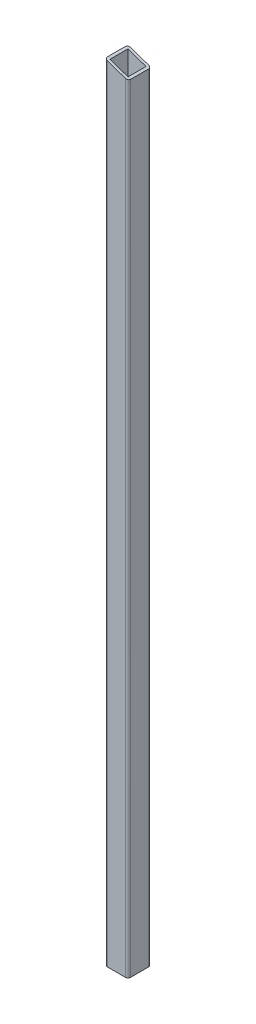
ISO-10303-21;
HEADER;
FILE_DESCRIPTION(('STEP AP214'),'2;1');
FILE_NAME('part.step','',(''),(''),'','','');
FILE_SCHEMA(('AUTOMOTIVE_DESIGN { 1 0 10303 214 1 1 1 1 }'));
ENDSEC;
DATA;
#1=APPLICATION_CONTEXT('core data for automotive mechanical design processes');
#2=APPLICATION_PROTOCOL_DEFINITION('international standard','automotive_design',2000,#1);
#3=PRODUCT_CONTEXT('',#1,'mechanical');
#4=PRODUCT('Part','Part','',(#3));
#5=PRODUCT_RELATED_PRODUCT_CATEGORY('part','',(#4));
#6=PRODUCT_DEFINITION_FORMATION('','',#4);
#7=PRODUCT_DEFINITION_CONTEXT('part definition',#1,'design');
#8=PRODUCT_DEFINITION('design','',#6,#7);
#9=PRODUCT_DEFINITION_SHAPE('','',#8);
#10=(LENGTH_UNIT() NAMED_UNIT(*) SI_UNIT(.MILLI.,.METRE.));
#11=(NAMED_UNIT(*) PLANE_ANGLE_UNIT() SI_UNIT($,.RADIAN.));
#12=(NAMED_UNIT(*) SI_UNIT($,.STERADIAN.) SOLID_ANGLE_UNIT());
#13=UNCERTAINTY_MEASURE_WITH_UNIT(LENGTH_MEASURE(1.E-05),#10,'distance_accuracy_value','');
#14=(GEOMETRIC_REPRESENTATION_CONTEXT(3) GLOBAL_UNCERTAINTY_ASSIGNED_CONTEXT((#13)) GLOBAL_UNIT_ASSIGNED_CONTEXT((#10,
#11,#12)) REPRESENTATION_CONTEXT('',''));
#15=CARTESIAN_POINT('',(0.,0.,0.));
#16=DIRECTION('',(0.,0.,1.));
#17=DIRECTION('',(1.,0.,0.));
#18=AXIS2_PLACEMENT_3D('',#15,#16,#17);
#19=CARTESIAN_POINT('',(22.8,870.,2.8));
#20=DIRECTION('',(0.,-1.,0.));
#21=DIRECTION('',(0.,0.,-1.));
#22=AXIS2_PLACEMENT_3D('',#19,#20,#21);
#23=CYLINDRICAL_SURFACE('',#22,2.8);
#24=DIRECTION('',(0.,-1.,0.));
#25=VECTOR('',#24,1.);
#26=CARTESIAN_POINT('',(22.8,870.,0.));
#27=LINE('',#26,#25);
#28=CARTESIAN_POINT('',(22.8,862.149330416996,0.));
#29=VERTEX_POINT('',#28);
#30=CARTESIAN_POINT('',(22.8,0.,0.));
#31=VERTEX_POINT('',#30);
#32=EDGE_CURVE('E40',#29,#31,#27,.T.);
#33=ORIENTED_EDGE('',*,*,#32,.F.);
#34=CARTESIAN_POINT('',(22.8,862.149330416996,2.8));
#35=DIRECTION('',(-0.32556815445715,-0.945518575599319,0.));
#36=DIRECTION('',(0.945518575599319,-0.32556815445715,0.));
#37=AXIS2_PLACEMENT_3D('',#34,#35,#36);
#38=ELLIPSE('',#37,2.96133790732267,2.8);
#39=CARTESIAN_POINT('',(25.6,861.185213099785,2.80000000000002));
#40=VERTEX_POINT('',#39);
#41=EDGE_CURVE('E189',#29,#40,#38,.T.);
#42=ORIENTED_EDGE('',*,*,#41,.T.);
#43=DIRECTION('',(0.,-1.,0.));
#44=VECTOR('',#43,1.);
#45=CARTESIAN_POINT('',(25.6,870.,2.80000000000002));
#46=LINE('',#45,#44);
#47=CARTESIAN_POINT('',(25.6,0.,2.80000000000002));
#48=VERTEX_POINT('',#47);
#49=EDGE_CURVE('E145',#40,#48,#46,.T.);
#50=ORIENTED_EDGE('',*,*,#49,.T.);
#51=CARTESIAN_POINT('',(22.8,0.,2.8));
#52=DIRECTION('',(0.,1.,0.));
#53=DIRECTION('',(0.,0.,-1.));
#54=AXIS2_PLACEMENT_3D('',#51,#52,#53);
#55=CIRCLE('',#54,2.8);
#56=EDGE_CURVE('E157',#48,#31,#55,.T.);
#57=ORIENTED_EDGE('',*,*,#56,.T.);
#58=EDGE_LOOP('',(#33,#42,#50,#57));
#59=FACE_BOUND('',#58,.T.);
#60=ADVANCED_FACE('F33',(#59),#23,.T.);
#61=CARTESIAN_POINT('',(2.80000000000002,870.,0.));
#62=DIRECTION('',(0.,0.,1.));
#63=DIRECTION('',(1.,0.,0.));
#64=AXIS2_PLACEMENT_3D('',#61,#62,#63);
#65=PLANE('',#64);
#66=DIRECTION('',(0.,-1.,0.));
#67=VECTOR('',#66,1.);
#68=CARTESIAN_POINT('',(2.80000000000002,870.,0.));
#69=LINE('',#68,#67);
#70=CARTESIAN_POINT('',(2.80000000000002,869.035882682789,0.));
#71=VERTEX_POINT('',#70);
#72=CARTESIAN_POINT('',(2.80000000000002,0.,0.));
#73=VERTEX_POINT('',#72);
#74=EDGE_CURVE('E179',#71,#73,#69,.T.);
#75=ORIENTED_EDGE('',*,*,#74,.F.);
#76=DIRECTION('',(0.945518575599319,-0.32556815445715,0.));
#77=VECTOR('',#76,1.);
#78=CARTESIAN_POINT('',(2.50321505504944,869.138073934544,0.));
#79=LINE('',#78,#77);
#80=EDGE_CURVE('E47',#71,#29,#79,.T.);
#81=ORIENTED_EDGE('',*,*,#80,.T.);
#82=ORIENTED_EDGE('',*,*,#32,.T.);
#83=DIRECTION('',(-1.,0.,0.));
#84=VECTOR('',#83,1.);
#85=CARTESIAN_POINT('',(2.80000000000002,0.,0.));
#86=LINE('',#85,#84);
#87=EDGE_CURVE('E160',#31,#73,#86,.T.);
#88=ORIENTED_EDGE('',*,*,#87,.T.);
#89=EDGE_LOOP('',(#75,#81,#82,#88));
#90=FACE_BOUND('',#89,.T.);
#91=ADVANCED_FACE('F181',(#90),#65,.F.);
#92=CARTESIAN_POINT('',(2.8,870.,2.8));
#93=DIRECTION('',(0.,-1.,0.));
#94=DIRECTION('',(0.,0.,-1.));
#95=AXIS2_PLACEMENT_3D('',#92,#93,#94);
#96=CYLINDRICAL_SURFACE('',#95,2.8);
#97=DIRECTION('',(0.,-1.,0.));
#98=VECTOR('',#97,1.);
#99=CARTESIAN_POINT('',(0.,870.,2.80000000000002));
#100=LINE('',#99,#98);
#101=CARTESIAN_POINT('',(0.,870.,2.80000000000002));
#102=VERTEX_POINT('',#101);
#103=CARTESIAN_POINT('',(0.,0.,2.80000000000002));
#104=VERTEX_POINT('',#103);
#105=EDGE_CURVE('E132',#102,#104,#100,.T.);
#106=ORIENTED_EDGE('',*,*,#105,.F.);
#107=CARTESIAN_POINT('',(2.8,869.035882682789,2.8));
#108=DIRECTION('',(-0.32556815445715,-0.945518575599319,0.));
#109=DIRECTION('',(0.945518575599319,-0.32556815445715,0.));
#110=AXIS2_PLACEMENT_3D('',#107,#108,#109);
#111=ELLIPSE('',#110,2.96133790732267,2.8);
#112=EDGE_CURVE('E55',#102,#71,#111,.T.);
#113=ORIENTED_EDGE('',*,*,#112,.T.);
#114=ORIENTED_EDGE('',*,*,#74,.T.);
#115=CARTESIAN_POINT('',(2.8,0.,2.8));
#116=DIRECTION('',(0.,1.,0.));
#117=DIRECTION('',(0.,0.,1.));
#118=AXIS2_PLACEMENT_3D('',#115,#116,#117);
#119=CIRCLE('',#118,2.8);
#120=EDGE_CURVE('E164',#73,#104,#119,.T.);
#121=ORIENTED_EDGE('',*,*,#120,.T.);
#122=EDGE_LOOP('',(#106,#113,#114,#121));
#123=FACE_BOUND('',#122,.T.);
#124=ADVANCED_FACE('F264',(#123),#96,.T.);
#125=CARTESIAN_POINT('',(0.,870.,2.80000000000002));
#126=DIRECTION('',(1.,0.,0.));
#127=DIRECTION('',(0.,0.,-1.));
#128=AXIS2_PLACEMENT_3D('',#125,#126,#127);
#129=PLANE('',#128);
#130=DIRECTION('',(0.,0.,1.));
#131=VECTOR('',#130,1.);
#132=CARTESIAN_POINT('',(0.,0.,2.80000000000002));
#133=LINE('',#132,#131);
#134=CARTESIAN_POINT('',(0.,0.,22.8));
#135=VERTEX_POINT('',#134);
#136=EDGE_CURVE('E128',#104,#135,#133,.T.);
#137=ORIENTED_EDGE('',*,*,#136,.T.);
#138=DIRECTION('',(0.,-1.,0.));
#139=VECTOR('',#138,1.);
#140=CARTESIAN_POINT('',(0.,870.,22.8));
#141=LINE('',#140,#139);
#142=CARTESIAN_POINT('',(0.,870.,22.7999999999999));
#143=VERTEX_POINT('',#142);
#144=EDGE_CURVE('E121',#143,#135,#141,.T.);
#145=ORIENTED_EDGE('',*,*,#144,.F.);
#146=DIRECTION('',(0.,0.,1.));
#147=VECTOR('',#146,1.);
#148=CARTESIAN_POINT('',(0.,870.,2.80000000000002));
#149=LINE('',#148,#147);
#150=EDGE_CURVE('E126',#102,#143,#149,.T.);
#151=ORIENTED_EDGE('',*,*,#150,.F.);
#152=ORIENTED_EDGE('',*,*,#105,.T.);
#153=EDGE_LOOP('',(#137,#145,#151,#152));
#154=FACE_BOUND('',#153,.T.);
#155=ADVANCED_FACE('F123',(#154),#129,.F.);
#156=CARTESIAN_POINT('',(2.8,870.,22.8));
#157=DIRECTION('',(0.,-1.,0.));
#158=DIRECTION('',(0.,0.,-1.));
#159=AXIS2_PLACEMENT_3D('',#156,#157,#158);
#160=CYLINDRICAL_SURFACE('',#159,2.8);
#161=DIRECTION('',(0.,-1.,0.));
#162=VECTOR('',#161,1.);
#163=CARTESIAN_POINT('',(2.80000000000002,870.,25.6));
#164=LINE('',#163,#162);
#165=CARTESIAN_POINT('',(2.80000000000002,869.035882682789,25.6));
#166=VERTEX_POINT('',#165);
#167=CARTESIAN_POINT('',(2.80000000000002,0.,25.6));
#168=VERTEX_POINT('',#167);
#169=EDGE_CURVE('E133',#166,#168,#164,.T.);
#170=ORIENTED_EDGE('',*,*,#169,.F.);
#171=CARTESIAN_POINT('',(2.8,869.035882682789,22.8));
#172=DIRECTION('',(-0.32556815445715,-0.945518575599319,0.));
#173=DIRECTION('',(0.945518575599319,-0.32556815445715,0.));
#174=AXIS2_PLACEMENT_3D('',#171,#172,#173);
#175=ELLIPSE('',#174,2.96133790732267,2.8);
#176=EDGE_CURVE('E137',#166,#143,#175,.T.);
#177=ORIENTED_EDGE('',*,*,#176,.T.);
#178=ORIENTED_EDGE('',*,*,#144,.T.);
#179=CARTESIAN_POINT('',(2.8,0.,22.8));
#180=DIRECTION('',(0.,1.,0.));
#181=DIRECTION('',(0.,0.,1.));
#182=AXIS2_PLACEMENT_3D('',#179,#180,#181);
#183=CIRCLE('',#182,2.8);
#184=EDGE_CURVE('E167',#135,#168,#183,.T.);
#185=ORIENTED_EDGE('',*,*,#184,.T.);
#186=EDGE_LOOP('',(#170,#177,#178,#185));
#187=FACE_BOUND('',#186,.T.);
#188=ADVANCED_FACE('F138',(#187),#160,.T.);
#189=CARTESIAN_POINT('',(2.80000000000002,870.,25.6));
#190=DIRECTION('',(0.,0.,-1.));
#191=DIRECTION('',(-1.,0.,0.));
#192=AXIS2_PLACEMENT_3D('',#189,#190,#191);
#193=PLANE('',#192);
#194=DIRECTION('',(0.,-1.,0.));
#195=VECTOR('',#194,1.);
#196=CARTESIAN_POINT('',(22.8,870.,25.6));
#197=LINE('',#196,#195);
#198=CARTESIAN_POINT('',(22.8,862.149330416996,25.6));
#199=VERTEX_POINT('',#198);
#200=CARTESIAN_POINT('',(22.8,0.,25.6));
#201=VERTEX_POINT('',#200);
#202=EDGE_CURVE('E175',#199,#201,#197,.T.);
#203=ORIENTED_EDGE('',*,*,#202,.F.);
#204=DIRECTION('',(-0.945518575599319,0.32556815445715,0.));
#205=VECTOR('',#204,1.);
#206=CARTESIAN_POINT('',(2.50321505504944,869.138073934544,25.6));
#207=LINE('',#206,#205);
#208=EDGE_CURVE('E141',#199,#166,#207,.T.);
#209=ORIENTED_EDGE('',*,*,#208,.T.);
#210=ORIENTED_EDGE('',*,*,#169,.T.);
#211=DIRECTION('',(1.,0.,0.));
#212=VECTOR('',#211,1.);
#213=CARTESIAN_POINT('',(2.80000000000002,0.,25.6));
#214=LINE('',#213,#212);
#215=EDGE_CURVE('E169',#168,#201,#214,.T.);
#216=ORIENTED_EDGE('',*,*,#215,.T.);
#217=EDGE_LOOP('',(#203,#209,#210,#216));
#218=FACE_BOUND('',#217,.T.);
#219=ADVANCED_FACE('F202',(#218),#193,.F.);
#220=CARTESIAN_POINT('',(22.8,870.,22.8));
#221=DIRECTION('',(0.,-1.,0.));
#222=DIRECTION('',(0.,0.,-1.));
#223=AXIS2_PLACEMENT_3D('',#220,#221,#222);
#224=CYLINDRICAL_SURFACE('',#223,2.8);
#225=DIRECTION('',(0.,-1.,0.));
#226=VECTOR('',#225,1.);
#227=CARTESIAN_POINT('',(25.6,870.,22.8));
#228=LINE('',#227,#226);
#229=CARTESIAN_POINT('',(25.6,861.185213099785,22.8));
#230=VERTEX_POINT('',#229);
#231=CARTESIAN_POINT('',(25.6,0.,22.8));
#232=VERTEX_POINT('',#231);
#233=EDGE_CURVE('E148',#230,#232,#228,.T.);
#234=ORIENTED_EDGE('',*,*,#233,.F.);
#235=CARTESIAN_POINT('',(22.8,862.149330416996,22.8));
#236=DIRECTION('',(-0.32556815445715,-0.945518575599319,0.));
#237=DIRECTION('',(0.945518575599319,-0.32556815445715,0.));
#238=AXIS2_PLACEMENT_3D('',#235,#236,#237);
#239=ELLIPSE('',#238,2.96133790732267,2.8);
#240=EDGE_CURVE('E200',#230,#199,#239,.T.);
#241=ORIENTED_EDGE('',*,*,#240,.T.);
#242=ORIENTED_EDGE('',*,*,#202,.T.);
#243=CARTESIAN_POINT('',(22.8,0.,22.8));
#244=DIRECTION('',(0.,1.,0.));
#245=DIRECTION('',(0.,0.,1.));
#246=AXIS2_PLACEMENT_3D('',#243,#244,#245);
#247=CIRCLE('',#246,2.8);
#248=EDGE_CURVE('E151',#201,#232,#247,.T.);
#249=ORIENTED_EDGE('',*,*,#248,.T.);
#250=EDGE_LOOP('',(#234,#241,#242,#249));
#251=FACE_BOUND('',#250,.T.);
#252=ADVANCED_FACE('F197',(#251),#224,.T.);
#253=CARTESIAN_POINT('',(25.6,870.,2.80000000000002));
#254=DIRECTION('',(-1.,0.,0.));
#255=DIRECTION('',(0.,0.,1.));
#256=AXIS2_PLACEMENT_3D('',#253,#254,#255);
#257=PLANE('',#256);
#258=ORIENTED_EDGE('',*,*,#49,.F.);
#259=DIRECTION('',(0.,0.,1.));
#260=VECTOR('',#259,1.);
#261=CARTESIAN_POINT('',(25.6000000000001,861.185213099785,-1094.14120190298));
#262=LINE('',#261,#260);
#263=EDGE_CURVE('E250',#40,#230,#262,.T.);
#264=ORIENTED_EDGE('',*,*,#263,.T.);
#265=ORIENTED_EDGE('',*,*,#233,.T.);
#266=DIRECTION('',(0.,0.,-1.));
#267=VECTOR('',#266,1.);
#268=CARTESIAN_POINT('',(25.6,0.,2.80000000000002));
#269=LINE('',#268,#267);
#270=EDGE_CURVE('E146',#232,#48,#269,.T.);
#271=ORIENTED_EDGE('',*,*,#270,.T.);
#272=EDGE_LOOP('',(#258,#264,#265,#271));
#273=FACE_BOUND('',#272,.T.);
#274=ADVANCED_FACE('F192',(#273),#257,.F.);
#275=CARTESIAN_POINT('',(22.8,0.,2.8));
#276=DIRECTION('',(0.,-1.,0.));
#277=DIRECTION('',(0.,0.,-1.));
#278=AXIS2_PLACEMENT_3D('',#275,#276,#277);
#279=PLANE('',#278);
#280=DIRECTION('',(0.,0.,1.));
#281=VECTOR('',#280,1.);
#282=CARTESIAN_POINT('',(22.8,0.,2.8));
#283=LINE('',#282,#281);
#284=CARTESIAN_POINT('',(22.8,0.,2.8));
#285=VERTEX_POINT('',#284);
#286=CARTESIAN_POINT('',(22.8,0.,22.8));
#287=VERTEX_POINT('',#286);
#288=EDGE_CURVE('E211',#285,#287,#283,.T.);
#289=ORIENTED_EDGE('',*,*,#288,.F.);
#290=DIRECTION('',(1.,0.,0.));
#291=VECTOR('',#290,1.);
#292=CARTESIAN_POINT('',(2.8,0.,2.8));
#293=LINE('',#292,#291);
#294=CARTESIAN_POINT('',(2.8,0.,2.8));
#295=VERTEX_POINT('',#294);
#296=EDGE_CURVE('E220',#295,#285,#293,.T.);
#297=ORIENTED_EDGE('',*,*,#296,.F.);
#298=DIRECTION('',(0.,0.,-1.));
#299=VECTOR('',#298,1.);
#300=CARTESIAN_POINT('',(2.8,0.,2.8));
#301=LINE('',#300,#299);
#302=CARTESIAN_POINT('',(2.8,0.,22.8));
#303=VERTEX_POINT('',#302);
#304=EDGE_CURVE('E217',#303,#295,#301,.T.);
#305=ORIENTED_EDGE('',*,*,#304,.F.);
#306=DIRECTION('',(-1.,0.,0.));
#307=VECTOR('',#306,1.);
#308=CARTESIAN_POINT('',(2.8,0.,22.8));
#309=LINE('',#308,#307);
#310=EDGE_CURVE('E214',#287,#303,#309,.T.);
#311=ORIENTED_EDGE('',*,*,#310,.F.);
#312=EDGE_LOOP('',(#289,#297,#305,#311));
#313=FACE_BOUND('',#312,.T.);
#314=ORIENTED_EDGE('',*,*,#56,.F.);
#315=ORIENTED_EDGE('',*,*,#270,.F.);
#316=ORIENTED_EDGE('',*,*,#248,.F.);
#317=ORIENTED_EDGE('',*,*,#215,.F.);
#318=ORIENTED_EDGE('',*,*,#184,.F.);
#319=ORIENTED_EDGE('',*,*,#136,.F.);
#320=ORIENTED_EDGE('',*,*,#120,.F.);
#321=ORIENTED_EDGE('',*,*,#87,.F.);
#322=EDGE_LOOP('',(#314,#315,#316,#317,#318,#319,#320,#321));
#323=FACE_BOUND('',#322,.T.);
#324=ADVANCED_FACE('F186',(#313,#323),#279,.T.);
#325=CARTESIAN_POINT('',(22.8,1040.5,2.8));
#326=DIRECTION('',(1.,0.,0.));
#327=DIRECTION('',(0.,0.,-1.));
#328=AXIS2_PLACEMENT_3D('',#325,#326,#327);
#329=PLANE('',#328);
#330=DIRECTION('',(0.,-1.,0.));
#331=VECTOR('',#330,1.);
#332=CARTESIAN_POINT('',(22.8,1040.5,22.8));
#333=LINE('',#332,#331);
#334=CARTESIAN_POINT('',(22.8,862.149330416996,22.8));
#335=VERTEX_POINT('',#334);
#336=EDGE_CURVE('E155',#335,#287,#333,.T.);
#337=ORIENTED_EDGE('',*,*,#336,.F.);
#338=DIRECTION('',(0.,0.,-1.));
#339=VECTOR('',#338,1.);
#340=CARTESIAN_POINT('',(22.8,862.149330416996,2.80000000000001));
#341=LINE('',#340,#339);
#342=CARTESIAN_POINT('',(22.8,862.149330416996,2.8));
#343=VERTEX_POINT('',#342);
#344=EDGE_CURVE('E204',#335,#343,#341,.T.);
#345=ORIENTED_EDGE('',*,*,#344,.T.);
#346=DIRECTION('',(0.,-1.,0.));
#347=VECTOR('',#346,1.);
#348=CARTESIAN_POINT('',(22.8,1040.5,2.8));
#349=LINE('',#348,#347);
#350=EDGE_CURVE('E161',#343,#285,#349,.T.);
#351=ORIENTED_EDGE('',*,*,#350,.T.);
#352=ORIENTED_EDGE('',*,*,#288,.T.);
#353=EDGE_LOOP('',(#337,#345,#351,#352));
#354=FACE_BOUND('',#353,.T.);
#355=ADVANCED_FACE('F237',(#354),#329,.F.);
#356=CARTESIAN_POINT('',(2.8,1040.5,2.8));
#357=DIRECTION('',(0.,0.,-1.));
#358=DIRECTION('',(-1.,0.,0.));
#359=AXIS2_PLACEMENT_3D('',#356,#357,#358);
#360=PLANE('',#359);
#361=ORIENTED_EDGE('',*,*,#350,.F.);
#362=DIRECTION('',(-0.945518575599319,0.32556815445715,0.));
#363=VECTOR('',#362,1.);
#364=CARTESIAN_POINT('',(-49.9819257164619,887.21015718957,2.79999999999999));
#365=LINE('',#364,#363);
#366=CARTESIAN_POINT('',(2.8,869.035882682789,2.8));
#367=VERTEX_POINT('',#366);
#368=EDGE_CURVE('E247',#343,#367,#365,.T.);
#369=ORIENTED_EDGE('',*,*,#368,.T.);
#370=DIRECTION('',(0.,-1.,0.));
#371=VECTOR('',#370,1.);
#372=CARTESIAN_POINT('',(2.8,1040.5,2.8));
#373=LINE('',#372,#371);
#374=EDGE_CURVE('E224',#367,#295,#373,.T.);
#375=ORIENTED_EDGE('',*,*,#374,.T.);
#376=ORIENTED_EDGE('',*,*,#296,.T.);
#377=EDGE_LOOP('',(#361,#369,#375,#376));
#378=FACE_BOUND('',#377,.T.);
#379=ADVANCED_FACE('F246',(#378),#360,.F.);
#380=CARTESIAN_POINT('',(2.8,1040.5,2.8));
#381=DIRECTION('',(-1.,0.,0.));
#382=DIRECTION('',(0.,0.,1.));
#383=AXIS2_PLACEMENT_3D('',#380,#381,#382);
#384=PLANE('',#383);
#385=ORIENTED_EDGE('',*,*,#374,.F.);
#386=DIRECTION('',(0.,0.,1.));
#387=VECTOR('',#386,1.);
#388=CARTESIAN_POINT('',(2.8,869.035882682789,2.8));
#389=LINE('',#388,#387);
#390=CARTESIAN_POINT('',(2.8,869.035882682789,22.8));
#391=VERTEX_POINT('',#390);
#392=EDGE_CURVE('E243',#367,#391,#389,.T.);
#393=ORIENTED_EDGE('',*,*,#392,.T.);
#394=DIRECTION('',(0.,-1.,0.));
#395=VECTOR('',#394,1.);
#396=CARTESIAN_POINT('',(2.8,1040.5,22.8));
#397=LINE('',#396,#395);
#398=EDGE_CURVE('E225',#391,#303,#397,.T.);
#399=ORIENTED_EDGE('',*,*,#398,.T.);
#400=ORIENTED_EDGE('',*,*,#304,.T.);
#401=EDGE_LOOP('',(#385,#393,#399,#400));
#402=FACE_BOUND('',#401,.T.);
#403=ADVANCED_FACE('F242',(#402),#384,.F.);
#404=CARTESIAN_POINT('',(2.8,1040.5,22.8));
#405=DIRECTION('',(0.,0.,1.));
#406=DIRECTION('',(1.,0.,0.));
#407=AXIS2_PLACEMENT_3D('',#404,#405,#406);
#408=PLANE('',#407);
#409=ORIENTED_EDGE('',*,*,#398,.F.);
#410=DIRECTION('',(0.945518575599319,-0.32556815445715,0.));
#411=VECTOR('',#410,1.);
#412=CARTESIAN_POINT('',(-49.9819257164619,887.21015718957,22.8));
#413=LINE('',#412,#411);
#414=EDGE_CURVE('E11',#391,#335,#413,.T.);
#415=ORIENTED_EDGE('',*,*,#414,.T.);
#416=ORIENTED_EDGE('',*,*,#336,.T.);
#417=ORIENTED_EDGE('',*,*,#310,.T.);
#418=EDGE_LOOP('',(#409,#415,#416,#417));
#419=FACE_BOUND('',#418,.T.);
#420=ADVANCED_FACE('F231',(#419),#408,.F.);
#421=CARTESIAN_POINT('',(1.93758412422685E-13,870.,-1094.14120190298));
#422=DIRECTION('',(-0.32556815445715,-0.945518575599319,0.));
#423=DIRECTION('',(0.945518575599319,-0.32556815445715,0.));
#424=AXIS2_PLACEMENT_3D('',#421,#422,#423);
#425=PLANE('',#424);
#426=ORIENTED_EDGE('',*,*,#344,.F.);
#427=ORIENTED_EDGE('',*,*,#414,.F.);
#428=ORIENTED_EDGE('',*,*,#392,.F.);
#429=ORIENTED_EDGE('',*,*,#368,.F.);
#430=EDGE_LOOP('',(#426,#427,#428,#429));
#431=FACE_BOUND('',#430,.T.);
#432=ORIENTED_EDGE('',*,*,#41,.F.);
#433=ORIENTED_EDGE('',*,*,#80,.F.);
#434=ORIENTED_EDGE('',*,*,#112,.F.);
#435=ORIENTED_EDGE('',*,*,#150,.T.);
#436=ORIENTED_EDGE('',*,*,#176,.F.);
#437=ORIENTED_EDGE('',*,*,#208,.F.);
#438=ORIENTED_EDGE('',*,*,#240,.F.);
#439=ORIENTED_EDGE('',*,*,#263,.F.);
#440=EDGE_LOOP('',(#432,#433,#434,#435,#436,#437,#438,#439));
#441=FACE_BOUND('',#440,.T.);
#442=ADVANCED_FACE('F144',(#431,#441),#425,.F.);
#443=CLOSED_SHELL('',(#60,#91,#124,#155,#188,#219,#252,#274,#324,#355,#379,#403,#420,#442));
#444=MANIFOLD_SOLID_BREP('B2',#443);
#445=ADVANCED_BREP_SHAPE_REPRESENTATION('',(#18,#444),#14);
#446=SHAPE_DEFINITION_REPRESENTATION(#9,#445);
ENDSEC;
END-ISO-10303-21;
